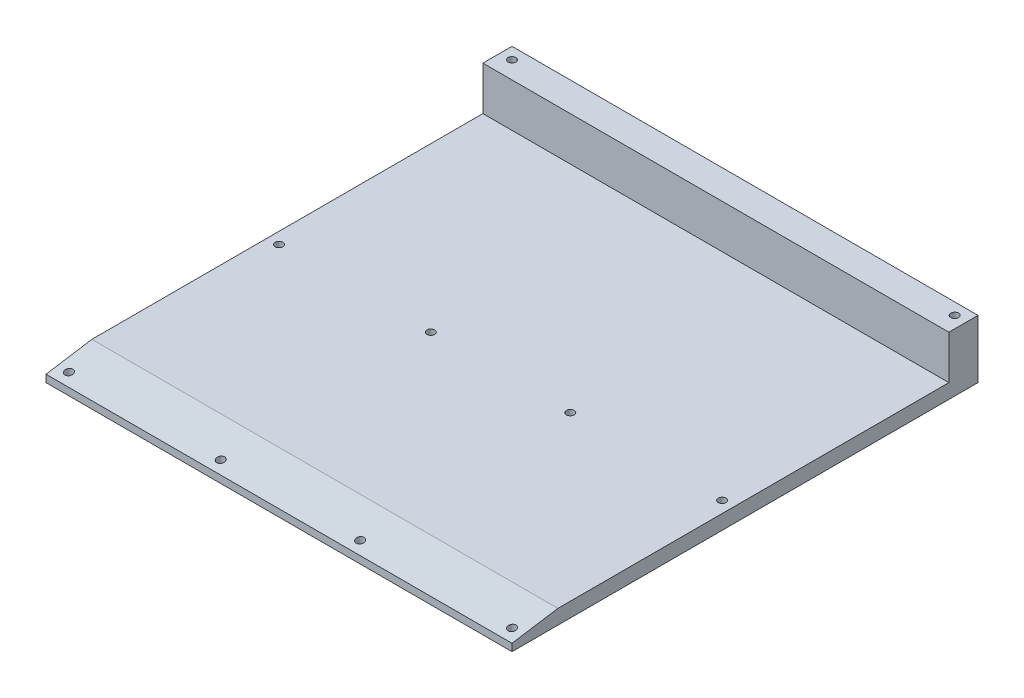
ISO-10303-21;
HEADER;
FILE_DESCRIPTION(('STEP AP214'),'2;1');
FILE_NAME('part.step','',(''),(''),'','','');
FILE_SCHEMA(('AUTOMOTIVE_DESIGN { 1 0 10303 214 1 1 1 1 }'));
ENDSEC;
DATA;
#1=APPLICATION_CONTEXT('core data for automotive mechanical design processes');
#2=APPLICATION_PROTOCOL_DEFINITION('international standard','automotive_design',2000,#1);
#3=PRODUCT_CONTEXT('',#1,'mechanical');
#4=PRODUCT('Part','Part','',(#3));
#5=PRODUCT_RELATED_PRODUCT_CATEGORY('part','',(#4));
#6=PRODUCT_DEFINITION_FORMATION('','',#4);
#7=PRODUCT_DEFINITION_CONTEXT('part definition',#1,'design');
#8=PRODUCT_DEFINITION('design','',#6,#7);
#9=PRODUCT_DEFINITION_SHAPE('','',#8);
#10=(LENGTH_UNIT() NAMED_UNIT(*) SI_UNIT(.MILLI.,.METRE.));
#11=(NAMED_UNIT(*) PLANE_ANGLE_UNIT() SI_UNIT($,.RADIAN.));
#12=(NAMED_UNIT(*) SI_UNIT($,.STERADIAN.) SOLID_ANGLE_UNIT());
#13=UNCERTAINTY_MEASURE_WITH_UNIT(LENGTH_MEASURE(1.E-05),#10,'distance_accuracy_value','');
#14=(GEOMETRIC_REPRESENTATION_CONTEXT(3) GLOBAL_UNCERTAINTY_ASSIGNED_CONTEXT((#13)) GLOBAL_UNIT_ASSIGNED_CONTEXT((#10,
#11,#12)) REPRESENTATION_CONTEXT('',''));
#15=CARTESIAN_POINT('',(0.,0.,0.));
#16=DIRECTION('',(0.,0.,1.));
#17=DIRECTION('',(1.,0.,0.));
#18=AXIS2_PLACEMENT_3D('',#15,#16,#17);
#19=CARTESIAN_POINT('',(0.,6.35,0.));
#20=DIRECTION('',(0.,1.,0.));
#21=DIRECTION('',(0.,0.,1.));
#22=AXIS2_PLACEMENT_3D('',#19,#20,#21);
#23=PLANE('',#22);
#24=DIRECTION('',(1.,0.,0.));
#25=VECTOR('',#24,1.);
#26=CARTESIAN_POINT('',(-127.,6.35,-190.5));
#27=LINE('',#26,#25);
#28=CARTESIAN_POINT('',(-127.,6.35,-190.5));
#29=VERTEX_POINT('',#28);
#30=CARTESIAN_POINT('',(76.2,6.35,-190.5));
#31=VERTEX_POINT('',#30);
#32=EDGE_CURVE('E62',#29,#31,#27,.T.);
#33=ORIENTED_EDGE('',*,*,#32,.F.);
#34=DIRECTION('',(0.,0.,-1.));
#35=VECTOR('',#34,1.);
#36=CARTESIAN_POINT('',(-127.,6.35,0.));
#37=LINE('',#36,#35);
#38=CARTESIAN_POINT('',(-127.,6.35,-20.));
#39=VERTEX_POINT('',#38);
#40=EDGE_CURVE('E132',#39,#29,#37,.T.);
#41=ORIENTED_EDGE('',*,*,#40,.F.);
#42=DIRECTION('',(-1.,0.,0.));
#43=VECTOR('',#42,1.);
#44=CARTESIAN_POINT('',(76.2,6.35,-20.));
#45=LINE('',#44,#43);
#46=CARTESIAN_POINT('',(76.2,6.35,-20.));
#47=VERTEX_POINT('',#46);
#48=EDGE_CURVE('E196',#47,#39,#45,.T.);
#49=ORIENTED_EDGE('',*,*,#48,.F.);
#50=DIRECTION('',(0.,0.,-1.));
#51=VECTOR('',#50,1.);
#52=CARTESIAN_POINT('',(76.2,6.35,0.));
#53=LINE('',#52,#51);
#54=EDGE_CURVE('E235',#47,#31,#53,.T.);
#55=ORIENTED_EDGE('',*,*,#54,.T.);
#56=EDGE_LOOP('',(#33,#41,#49,#55));
#57=FACE_BOUND('',#56,.T.);
#58=CARTESIAN_POINT('',(5.,6.35,-96.6));
#59=DIRECTION('',(0.,1.,0.));
#60=DIRECTION('',(0.,0.,1.));
#61=AXIS2_PLACEMENT_3D('',#58,#59,#60);
#62=CIRCLE('',#61,1.70000000000001);
#63=CARTESIAN_POINT('',(5.,6.35,-94.9));
#64=VERTEX_POINT('',#63);
#65=EDGE_CURVE('E219',#64,#64,#62,.T.);
#66=ORIENTED_EDGE('',*,*,#65,.F.);
#67=EDGE_LOOP('',(#66));
#68=FACE_BOUND('',#67,.T.);
#69=CARTESIAN_POINT('',(71.2,6.35,-96.6));
#70=DIRECTION('',(0.,1.,0.));
#71=DIRECTION('',(0.,0.,1.));
#72=AXIS2_PLACEMENT_3D('',#69,#70,#71);
#73=CIRCLE('',#72,1.7);
#74=CARTESIAN_POINT('',(71.2,6.35,-94.9));
#75=VERTEX_POINT('',#74);
#76=EDGE_CURVE('E220',#75,#75,#73,.F.);
#77=ORIENTED_EDGE('',*,*,#76,.T.);
#78=EDGE_LOOP('',(#77));
#79=FACE_BOUND('',#78,.T.);
#80=CARTESIAN_POINT('',(-55.8,6.35,-96.6));
#81=DIRECTION('',(0.,-1.,0.));
#82=DIRECTION('',(0.,0.,1.));
#83=AXIS2_PLACEMENT_3D('',#80,#81,#82);
#84=CIRCLE('',#83,1.70000000000001);
#85=CARTESIAN_POINT('',(-55.8,6.35,-94.9));
#86=VERTEX_POINT('',#85);
#87=EDGE_CURVE('E161',#86,#86,#84,.T.);
#88=ORIENTED_EDGE('',*,*,#87,.T.);
#89=EDGE_LOOP('',(#88));
#90=FACE_BOUND('',#89,.T.);
#91=CARTESIAN_POINT('',(-122.,6.35,-96.6));
#92=DIRECTION('',(0.,-1.,0.));
#93=DIRECTION('',(0.,0.,1.));
#94=AXIS2_PLACEMENT_3D('',#91,#92,#93);
#95=CIRCLE('',#94,1.7);
#96=CARTESIAN_POINT('',(-122.,6.35,-94.9));
#97=VERTEX_POINT('',#96);
#98=EDGE_CURVE('E162',#97,#97,#95,.F.);
#99=ORIENTED_EDGE('',*,*,#98,.F.);
#100=EDGE_LOOP('',(#99));
#101=FACE_BOUND('',#100,.T.);
#102=ADVANCED_FACE('F45',(#57,#68,#79,#90,#101),#23,.T.);
#103=CARTESIAN_POINT('',(0.,0.,0.));
#104=DIRECTION('',(0.,1.,0.));
#105=DIRECTION('',(0.,0.,1.));
#106=AXIS2_PLACEMENT_3D('',#103,#104,#105);
#107=PLANE('',#106);
#108=CARTESIAN_POINT('',(71.2,0.,-5.));
#109=DIRECTION('',(0.,1.,0.));
#110=DIRECTION('',(0.,0.,1.));
#111=AXIS2_PLACEMENT_3D('',#108,#109,#110);
#112=CIRCLE('',#111,1.7);
#113=CARTESIAN_POINT('',(71.2,0.,-3.30000000000001));
#114=VERTEX_POINT('',#113);
#115=EDGE_CURVE('E207',#114,#114,#112,.T.);
#116=ORIENTED_EDGE('',*,*,#115,.T.);
#117=EDGE_LOOP('',(#116));
#118=FACE_BOUND('',#117,.T.);
#119=CARTESIAN_POINT('',(71.12,0.,-198.12));
#120=DIRECTION('',(0.,1.,0.));
#121=DIRECTION('',(0.,0.,1.));
#122=AXIS2_PLACEMENT_3D('',#119,#120,#121);
#123=CIRCLE('',#122,1.7);
#124=CARTESIAN_POINT('',(71.12,0.,-196.42));
#125=VERTEX_POINT('',#124);
#126=EDGE_CURVE('E206',#125,#125,#123,.T.);
#127=ORIENTED_EDGE('',*,*,#126,.T.);
#128=EDGE_LOOP('',(#127));
#129=FACE_BOUND('',#128,.T.);
#130=CARTESIAN_POINT('',(5.,0.,-96.6));
#131=DIRECTION('',(0.,1.,0.));
#132=DIRECTION('',(0.,0.,1.));
#133=AXIS2_PLACEMENT_3D('',#130,#131,#132);
#134=CIRCLE('',#133,1.70000000000001);
#135=CARTESIAN_POINT('',(5.,0.,-94.9));
#136=VERTEX_POINT('',#135);
#137=EDGE_CURVE('E227',#136,#136,#134,.T.);
#138=ORIENTED_EDGE('',*,*,#137,.T.);
#139=EDGE_LOOP('',(#138));
#140=FACE_BOUND('',#139,.T.);
#141=DIRECTION('',(1.,0.,0.));
#142=VECTOR('',#141,1.);
#143=CARTESIAN_POINT('',(0.,0.,0.));
#144=LINE('',#143,#142);
#145=CARTESIAN_POINT('',(-127.,0.,0.));
#146=VERTEX_POINT('',#145);
#147=CARTESIAN_POINT('',(76.2,0.,0.));
#148=VERTEX_POINT('',#147);
#149=EDGE_CURVE('E231',#146,#148,#144,.T.);
#150=ORIENTED_EDGE('',*,*,#149,.F.);
#151=DIRECTION('',(0.,0.,-1.));
#152=VECTOR('',#151,1.);
#153=CARTESIAN_POINT('',(-127.,0.,0.));
#154=LINE('',#153,#152);
#155=CARTESIAN_POINT('',(-127.,0.,-203.2));
#156=VERTEX_POINT('',#155);
#157=EDGE_CURVE('E173',#146,#156,#154,.T.);
#158=ORIENTED_EDGE('',*,*,#157,.T.);
#159=DIRECTION('',(-1.,0.,0.));
#160=VECTOR('',#159,1.);
#161=CARTESIAN_POINT('',(0.,0.,-203.2));
#162=LINE('',#161,#160);
#163=CARTESIAN_POINT('',(76.2,0.,-203.2));
#164=VERTEX_POINT('',#163);
#165=EDGE_CURVE('E238',#164,#156,#162,.T.);
#166=ORIENTED_EDGE('',*,*,#165,.F.);
#167=DIRECTION('',(0.,0.,-1.));
#168=VECTOR('',#167,1.);
#169=CARTESIAN_POINT('',(76.2,0.,0.));
#170=LINE('',#169,#168);
#171=EDGE_CURVE('E69',#148,#164,#170,.T.);
#172=ORIENTED_EDGE('',*,*,#171,.F.);
#173=EDGE_LOOP('',(#150,#158,#166,#172));
#174=FACE_BOUND('',#173,.T.);
#175=CARTESIAN_POINT('',(5.,0.,-5.));
#176=DIRECTION('',(0.,1.,0.));
#177=DIRECTION('',(0.,0.,1.));
#178=AXIS2_PLACEMENT_3D('',#175,#176,#177);
#179=CIRCLE('',#178,1.7);
#180=CARTESIAN_POINT('',(5.,0.,-3.30000000000001));
#181=VERTEX_POINT('',#180);
#182=EDGE_CURVE('E211',#181,#181,#179,.F.);
#183=ORIENTED_EDGE('',*,*,#182,.F.);
#184=EDGE_LOOP('',(#183));
#185=FACE_BOUND('',#184,.T.);
#186=CARTESIAN_POINT('',(71.2,0.,-96.6));
#187=DIRECTION('',(0.,1.,0.));
#188=DIRECTION('',(0.,0.,1.));
#189=AXIS2_PLACEMENT_3D('',#186,#187,#188);
#190=CIRCLE('',#189,1.7);
#191=CARTESIAN_POINT('',(71.2,0.,-94.9));
#192=VERTEX_POINT('',#191);
#193=EDGE_CURVE('E215',#192,#192,#190,.F.);
#194=ORIENTED_EDGE('',*,*,#193,.F.);
#195=EDGE_LOOP('',(#194));
#196=FACE_BOUND('',#195,.T.);
#197=CARTESIAN_POINT('',(-122.,0.,-5.));
#198=DIRECTION('',(0.,-1.,0.));
#199=DIRECTION('',(0.,0.,1.));
#200=AXIS2_PLACEMENT_3D('',#197,#198,#199);
#201=CIRCLE('',#200,1.7);
#202=CARTESIAN_POINT('',(-122.,0.,-3.30000000000001));
#203=VERTEX_POINT('',#202);
#204=EDGE_CURVE('E149',#203,#203,#201,.T.);
#205=ORIENTED_EDGE('',*,*,#204,.F.);
#206=EDGE_LOOP('',(#205));
#207=FACE_BOUND('',#206,.T.);
#208=CARTESIAN_POINT('',(-121.92,0.,-198.12));
#209=DIRECTION('',(0.,-1.,0.));
#210=DIRECTION('',(0.,0.,1.));
#211=AXIS2_PLACEMENT_3D('',#208,#209,#210);
#212=CIRCLE('',#211,1.7);
#213=CARTESIAN_POINT('',(-121.92,0.,-196.42));
#214=VERTEX_POINT('',#213);
#215=EDGE_CURVE('E148',#214,#214,#212,.T.);
#216=ORIENTED_EDGE('',*,*,#215,.F.);
#217=EDGE_LOOP('',(#216));
#218=FACE_BOUND('',#217,.T.);
#219=CARTESIAN_POINT('',(-55.8,0.,-96.6));
#220=DIRECTION('',(0.,-1.,0.));
#221=DIRECTION('',(0.,0.,1.));
#222=AXIS2_PLACEMENT_3D('',#219,#220,#221);
#223=CIRCLE('',#222,1.70000000000001);
#224=CARTESIAN_POINT('',(-55.8,0.,-94.9));
#225=VERTEX_POINT('',#224);
#226=EDGE_CURVE('E169',#225,#225,#223,.T.);
#227=ORIENTED_EDGE('',*,*,#226,.F.);
#228=EDGE_LOOP('',(#227));
#229=FACE_BOUND('',#228,.T.);
#230=CARTESIAN_POINT('',(-55.8,0.,-5.));
#231=DIRECTION('',(0.,-1.,0.));
#232=DIRECTION('',(0.,0.,1.));
#233=AXIS2_PLACEMENT_3D('',#230,#231,#232);
#234=CIRCLE('',#233,1.7);
#235=CARTESIAN_POINT('',(-55.8,0.,-3.30000000000001));
#236=VERTEX_POINT('',#235);
#237=EDGE_CURVE('E153',#236,#236,#234,.F.);
#238=ORIENTED_EDGE('',*,*,#237,.T.);
#239=EDGE_LOOP('',(#238));
#240=FACE_BOUND('',#239,.T.);
#241=CARTESIAN_POINT('',(-122.,0.,-96.6));
#242=DIRECTION('',(0.,-1.,0.));
#243=DIRECTION('',(0.,0.,1.));
#244=AXIS2_PLACEMENT_3D('',#241,#242,#243);
#245=CIRCLE('',#244,1.7);
#246=CARTESIAN_POINT('',(-122.,0.,-94.9));
#247=VERTEX_POINT('',#246);
#248=EDGE_CURVE('E157',#247,#247,#245,.F.);
#249=ORIENTED_EDGE('',*,*,#248,.T.);
#250=EDGE_LOOP('',(#249));
#251=FACE_BOUND('',#250,.T.);
#252=ADVANCED_FACE('F251',(#118,#129,#140,#174,#185,#196,#207,#218,#229,#240,#251),#107,.F.);
#253=CARTESIAN_POINT('',(0.,6.35,0.));
#254=DIRECTION('',(0.,0.,-1.));
#255=DIRECTION('',(-1.,0.,0.));
#256=AXIS2_PLACEMENT_3D('',#253,#254,#255);
#257=PLANE('',#256);
#258=DIRECTION('',(0.,-1.,0.));
#259=VECTOR('',#258,1.);
#260=CARTESIAN_POINT('',(76.2,6.35,0.));
#261=LINE('',#260,#259);
#262=CARTESIAN_POINT('',(76.2,3.175,0.));
#263=VERTEX_POINT('',#262);
#264=EDGE_CURVE('E11',#263,#148,#261,.T.);
#265=ORIENTED_EDGE('',*,*,#264,.F.);
#266=DIRECTION('',(-1.,0.,0.));
#267=VECTOR('',#266,1.);
#268=CARTESIAN_POINT('',(76.2,3.175,0.));
#269=LINE('',#268,#267);
#270=CARTESIAN_POINT('',(-127.,3.175,0.));
#271=VERTEX_POINT('',#270);
#272=EDGE_CURVE('E197',#263,#271,#269,.T.);
#273=ORIENTED_EDGE('',*,*,#272,.T.);
#274=DIRECTION('',(0.,-1.,0.));
#275=VECTOR('',#274,1.);
#276=CARTESIAN_POINT('',(-127.,6.35,0.));
#277=LINE('',#276,#275);
#278=EDGE_CURVE('E185',#271,#146,#277,.T.);
#279=ORIENTED_EDGE('',*,*,#278,.T.);
#280=ORIENTED_EDGE('',*,*,#149,.T.);
#281=EDGE_LOOP('',(#265,#273,#279,#280));
#282=FACE_BOUND('',#281,.T.);
#283=ADVANCED_FACE('F47',(#282),#257,.F.);
#284=CARTESIAN_POINT('',(76.2,6.35,0.));
#285=DIRECTION('',(-1.,0.,0.));
#286=DIRECTION('',(0.,0.,1.));
#287=AXIS2_PLACEMENT_3D('',#284,#285,#286);
#288=PLANE('',#287);
#289=ORIENTED_EDGE('',*,*,#54,.F.);
#290=DIRECTION('',(0.,-0.156786658464522,0.987632494264709));
#291=VECTOR('',#290,1.);
#292=CARTESIAN_POINT('',(76.2,3.0969519713349,0.491641125449416));
#293=LINE('',#292,#291);
#294=EDGE_CURVE('E189',#47,#263,#293,.T.);
#295=ORIENTED_EDGE('',*,*,#294,.T.);
#296=ORIENTED_EDGE('',*,*,#264,.T.);
#297=ORIENTED_EDGE('',*,*,#171,.T.);
#298=DIRECTION('',(0.,-1.,0.));
#299=VECTOR('',#298,1.);
#300=CARTESIAN_POINT('',(76.2,6.35,-203.2));
#301=LINE('',#300,#299);
#302=CARTESIAN_POINT('',(76.2,25.4,-203.2));
#303=VERTEX_POINT('',#302);
#304=EDGE_CURVE('E55',#303,#164,#301,.T.);
#305=ORIENTED_EDGE('',*,*,#304,.F.);
#306=DIRECTION('',(0.,0.,-1.));
#307=VECTOR('',#306,1.);
#308=CARTESIAN_POINT('',(76.2,25.4,-203.2));
#309=LINE('',#308,#307);
#310=CARTESIAN_POINT('',(76.2,25.4,-190.5));
#311=VERTEX_POINT('',#310);
#312=EDGE_CURVE('E117',#311,#303,#309,.T.);
#313=ORIENTED_EDGE('',*,*,#312,.F.);
#314=DIRECTION('',(0.,-1.,0.));
#315=VECTOR('',#314,1.);
#316=CARTESIAN_POINT('',(76.2,25.4,-190.5));
#317=LINE('',#316,#315);
#318=EDGE_CURVE('E112',#311,#31,#317,.T.);
#319=ORIENTED_EDGE('',*,*,#318,.T.);
#320=EDGE_LOOP('',(#289,#295,#296,#297,#305,#313,#319));
#321=FACE_BOUND('',#320,.T.);
#322=ADVANCED_FACE('F263',(#321),#288,.F.);
#323=CARTESIAN_POINT('',(0.,6.35,-203.2));
#324=DIRECTION('',(0.,0.,1.));
#325=DIRECTION('',(1.,0.,0.));
#326=AXIS2_PLACEMENT_3D('',#323,#324,#325);
#327=PLANE('',#326);
#328=ORIENTED_EDGE('',*,*,#165,.T.);
#329=DIRECTION('',(0.,-1.,0.));
#330=VECTOR('',#329,1.);
#331=CARTESIAN_POINT('',(-127.,6.35,-203.2));
#332=LINE('',#331,#330);
#333=CARTESIAN_POINT('',(-127.,25.4,-203.2));
#334=VERTEX_POINT('',#333);
#335=EDGE_CURVE('E179',#334,#156,#332,.T.);
#336=ORIENTED_EDGE('',*,*,#335,.F.);
#337=DIRECTION('',(-1.,0.,0.));
#338=VECTOR('',#337,1.);
#339=CARTESIAN_POINT('',(-127.,25.4,-203.2));
#340=LINE('',#339,#338);
#341=EDGE_CURVE('E125',#303,#334,#340,.T.);
#342=ORIENTED_EDGE('',*,*,#341,.F.);
#343=ORIENTED_EDGE('',*,*,#304,.T.);
#344=EDGE_LOOP('',(#328,#336,#342,#343));
#345=FACE_BOUND('',#344,.T.);
#346=ADVANCED_FACE('F249',(#345),#327,.F.);
#347=CARTESIAN_POINT('',(5.,0.,-96.6));
#348=DIRECTION('',(0.,1.,0.));
#349=DIRECTION('',(0.,0.,1.));
#350=AXIS2_PLACEMENT_3D('',#347,#348,#349);
#351=CYLINDRICAL_SURFACE('',#350,1.70000000000001);
#352=ORIENTED_EDGE('',*,*,#137,.F.);
#353=EDGE_LOOP('',(#352));
#354=FACE_BOUND('',#353,.T.);
#355=ORIENTED_EDGE('',*,*,#65,.T.);
#356=EDGE_LOOP('',(#355));
#357=FACE_BOUND('',#356,.T.);
#358=ADVANCED_FACE('F304',(#354,#357),#351,.F.);
#359=CARTESIAN_POINT('',(71.12,0.,-198.12));
#360=DIRECTION('',(0.,1.,0.));
#361=DIRECTION('',(0.,0.,1.));
#362=AXIS2_PLACEMENT_3D('',#359,#360,#361);
#363=CYLINDRICAL_SURFACE('',#362,1.7);
#364=ORIENTED_EDGE('',*,*,#126,.F.);
#365=EDGE_LOOP('',(#364));
#366=FACE_BOUND('',#365,.T.);
#367=CARTESIAN_POINT('',(71.12,25.4,-198.12));
#368=DIRECTION('',(0.,1.,0.));
#369=DIRECTION('',(0.,0.,-1.));
#370=AXIS2_PLACEMENT_3D('',#367,#368,#369);
#371=CIRCLE('',#370,1.70000000000001);
#372=CARTESIAN_POINT('',(71.12,25.4,-199.82));
#373=VERTEX_POINT('',#372);
#374=EDGE_CURVE('E272',#373,#373,#371,.T.);
#375=ORIENTED_EDGE('',*,*,#374,.T.);
#376=EDGE_LOOP('',(#375));
#377=FACE_BOUND('',#376,.T.);
#378=ADVANCED_FACE('F281',(#366,#377),#363,.F.);
#379=CARTESIAN_POINT('',(71.2,0.,-5.));
#380=DIRECTION('',(0.,1.,0.));
#381=DIRECTION('',(0.,0.,1.));
#382=AXIS2_PLACEMENT_3D('',#379,#380,#381);
#383=CYLINDRICAL_SURFACE('',#382,1.7);
#384=CARTESIAN_POINT('',(71.2,3.96875,-5.));
#385=DIRECTION('',(0.,-0.987632494264708,-0.156786658464522));
#386=DIRECTION('',(0.,0.156786658464522,-0.987632494264709));
#387=AXIS2_PLACEMENT_3D('',#384,#385,#386);
#388=ELLIPSE('',#387,1.72128803970312,1.7);
#389=CARTESIAN_POINT('',(71.2,4.238625,-6.7));
#390=VERTEX_POINT('',#389);
#391=EDGE_CURVE('E202',#390,#390,#388,.F.);
#392=ORIENTED_EDGE('',*,*,#391,.T.);
#393=EDGE_LOOP('',(#392));
#394=FACE_BOUND('',#393,.T.);
#395=ORIENTED_EDGE('',*,*,#115,.F.);
#396=EDGE_LOOP('',(#395));
#397=FACE_BOUND('',#396,.T.);
#398=ADVANCED_FACE('F393',(#394,#397),#383,.F.);
#399=CARTESIAN_POINT('',(5.,0.,-5.));
#400=DIRECTION('',(0.,1.,0.));
#401=DIRECTION('',(0.,0.,1.));
#402=AXIS2_PLACEMENT_3D('',#399,#400,#401);
#403=CYLINDRICAL_SURFACE('',#402,1.7);
#404=CARTESIAN_POINT('',(5.,3.96875,-5.));
#405=DIRECTION('',(0.,-0.987632494264708,-0.156786658464522));
#406=DIRECTION('',(0.,0.156786658464522,-0.987632494264709));
#407=AXIS2_PLACEMENT_3D('',#404,#405,#406);
#408=ELLIPSE('',#407,1.72128803970312,1.7);
#409=CARTESIAN_POINT('',(5.,4.238625,-6.7));
#410=VERTEX_POINT('',#409);
#411=EDGE_CURVE('E49',#410,#410,#408,.T.);
#412=ORIENTED_EDGE('',*,*,#411,.F.);
#413=EDGE_LOOP('',(#412));
#414=FACE_BOUND('',#413,.T.);
#415=ORIENTED_EDGE('',*,*,#182,.T.);
#416=EDGE_LOOP('',(#415));
#417=FACE_BOUND('',#416,.T.);
#418=ADVANCED_FACE('F460',(#414,#417),#403,.F.);
#419=CARTESIAN_POINT('',(71.2,0.,-96.6));
#420=DIRECTION('',(0.,1.,0.));
#421=DIRECTION('',(0.,0.,1.));
#422=AXIS2_PLACEMENT_3D('',#419,#420,#421);
#423=CYLINDRICAL_SURFACE('',#422,1.7);
#424=ORIENTED_EDGE('',*,*,#193,.T.);
#425=EDGE_LOOP('',(#424));
#426=FACE_BOUND('',#425,.T.);
#427=ORIENTED_EDGE('',*,*,#76,.F.);
#428=EDGE_LOOP('',(#427));
#429=FACE_BOUND('',#428,.T.);
#430=ADVANCED_FACE('F324',(#426,#429),#423,.F.);
#431=CARTESIAN_POINT('',(76.2,3.0969519713349,0.491641125449416));
#432=DIRECTION('',(0.,-0.987632494264708,-0.156786658464522));
#433=DIRECTION('',(0.,0.156786658464522,-0.987632494264709));
#434=AXIS2_PLACEMENT_3D('',#431,#432,#433);
#435=PLANE('',#434);
#436=ORIENTED_EDGE('',*,*,#48,.T.);
#437=DIRECTION('',(0.,-0.156786658464522,0.987632494264709));
#438=VECTOR('',#437,1.);
#439=CARTESIAN_POINT('',(-127.,3.0969519713349,0.491641125449416));
#440=LINE('',#439,#438);
#441=EDGE_CURVE('E134',#39,#271,#440,.T.);
#442=ORIENTED_EDGE('',*,*,#441,.T.);
#443=ORIENTED_EDGE('',*,*,#272,.F.);
#444=ORIENTED_EDGE('',*,*,#294,.F.);
#445=EDGE_LOOP('',(#436,#442,#443,#444));
#446=FACE_BOUND('',#445,.T.);
#447=ORIENTED_EDGE('',*,*,#411,.T.);
#448=EDGE_LOOP('',(#447));
#449=FACE_BOUND('',#448,.T.);
#450=ORIENTED_EDGE('',*,*,#391,.F.);
#451=EDGE_LOOP('',(#450));
#452=FACE_BOUND('',#451,.T.);
#453=CARTESIAN_POINT('',(-55.8,3.96875,-5.));
#454=DIRECTION('',(0.,0.987632494264708,0.156786658464522));
#455=DIRECTION('',(0.,0.156786658464522,-0.987632494264709));
#456=AXIS2_PLACEMENT_3D('',#453,#454,#455);
#457=ELLIPSE('',#456,1.72128803970312,1.7);
#458=CARTESIAN_POINT('',(-55.8,4.238625,-6.7));
#459=VERTEX_POINT('',#458);
#460=EDGE_CURVE('E139',#459,#459,#457,.T.);
#461=ORIENTED_EDGE('',*,*,#460,.F.);
#462=EDGE_LOOP('',(#461));
#463=FACE_BOUND('',#462,.T.);
#464=CARTESIAN_POINT('',(-122.,3.96875,-5.));
#465=DIRECTION('',(0.,0.987632494264708,0.156786658464522));
#466=DIRECTION('',(0.,0.156786658464522,-0.987632494264709));
#467=AXIS2_PLACEMENT_3D('',#464,#465,#466);
#468=ELLIPSE('',#467,1.72128803970312,1.7);
#469=CARTESIAN_POINT('',(-122.,4.238625,-6.7));
#470=VERTEX_POINT('',#469);
#471=EDGE_CURVE('E144',#470,#470,#468,.F.);
#472=ORIENTED_EDGE('',*,*,#471,.T.);
#473=EDGE_LOOP('',(#472));
#474=FACE_BOUND('',#473,.T.);
#475=ADVANCED_FACE('F258',(#446,#449,#452,#463,#474),#435,.F.);
#476=CARTESIAN_POINT('',(-127.,6.35,0.));
#477=DIRECTION('',(1.,0.,0.));
#478=DIRECTION('',(0.,0.,1.));
#479=AXIS2_PLACEMENT_3D('',#476,#477,#478);
#480=PLANE('',#479);
#481=ORIENTED_EDGE('',*,*,#40,.T.);
#482=DIRECTION('',(0.,-1.,0.));
#483=VECTOR('',#482,1.);
#484=CARTESIAN_POINT('',(-127.,25.4,-190.5));
#485=LINE('',#484,#483);
#486=CARTESIAN_POINT('',(-127.,25.4,-190.5));
#487=VERTEX_POINT('',#486);
#488=EDGE_CURVE('E110',#487,#29,#485,.T.);
#489=ORIENTED_EDGE('',*,*,#488,.F.);
#490=DIRECTION('',(0.,0.,1.));
#491=VECTOR('',#490,1.);
#492=CARTESIAN_POINT('',(-127.,25.4,-203.2));
#493=LINE('',#492,#491);
#494=EDGE_CURVE('E118',#334,#487,#493,.T.);
#495=ORIENTED_EDGE('',*,*,#494,.F.);
#496=ORIENTED_EDGE('',*,*,#335,.T.);
#497=ORIENTED_EDGE('',*,*,#157,.F.);
#498=ORIENTED_EDGE('',*,*,#278,.F.);
#499=ORIENTED_EDGE('',*,*,#441,.F.);
#500=EDGE_LOOP('',(#481,#489,#495,#496,#497,#498,#499));
#501=FACE_BOUND('',#500,.T.);
#502=ADVANCED_FACE('F130',(#501),#480,.F.);
#503=CARTESIAN_POINT('',(-55.8,0.,-96.6));
#504=DIRECTION('',(0.,1.,0.));
#505=DIRECTION('',(0.,0.,1.));
#506=AXIS2_PLACEMENT_3D('',#503,#504,#505);
#507=CYLINDRICAL_SURFACE('',#506,1.70000000000001);
#508=ORIENTED_EDGE('',*,*,#226,.T.);
#509=EDGE_LOOP('',(#508));
#510=FACE_BOUND('',#509,.T.);
#511=ORIENTED_EDGE('',*,*,#87,.F.);
#512=EDGE_LOOP('',(#511));
#513=FACE_BOUND('',#512,.T.);
#514=ADVANCED_FACE('F329',(#510,#513),#507,.F.);
#515=CARTESIAN_POINT('',(-121.92,0.,-198.12));
#516=DIRECTION('',(0.,1.,0.));
#517=DIRECTION('',(0.,0.,1.));
#518=AXIS2_PLACEMENT_3D('',#515,#516,#517);
#519=CYLINDRICAL_SURFACE('',#518,1.7);
#520=ORIENTED_EDGE('',*,*,#215,.T.);
#521=EDGE_LOOP('',(#520));
#522=FACE_BOUND('',#521,.T.);
#523=CARTESIAN_POINT('',(-121.92,25.4,-198.12));
#524=DIRECTION('',(0.,1.,0.));
#525=DIRECTION('',(0.,0.,1.));
#526=AXIS2_PLACEMENT_3D('',#523,#524,#525);
#527=CIRCLE('',#526,1.70000000000001);
#528=CARTESIAN_POINT('',(-121.92,25.4,-196.42));
#529=VERTEX_POINT('',#528);
#530=EDGE_CURVE('E269',#529,#529,#527,.T.);
#531=ORIENTED_EDGE('',*,*,#530,.T.);
#532=EDGE_LOOP('',(#531));
#533=FACE_BOUND('',#532,.T.);
#534=ADVANCED_FACE('F333',(#522,#533),#519,.F.);
#535=CARTESIAN_POINT('',(-122.,0.,-5.));
#536=DIRECTION('',(0.,1.,0.));
#537=DIRECTION('',(0.,0.,1.));
#538=AXIS2_PLACEMENT_3D('',#535,#536,#537);
#539=CYLINDRICAL_SURFACE('',#538,1.7);
#540=ORIENTED_EDGE('',*,*,#471,.F.);
#541=EDGE_LOOP('',(#540));
#542=FACE_BOUND('',#541,.T.);
#543=ORIENTED_EDGE('',*,*,#204,.T.);
#544=EDGE_LOOP('',(#543));
#545=FACE_BOUND('',#544,.T.);
#546=ADVANCED_FACE('F340',(#542,#545),#539,.F.);
#547=CARTESIAN_POINT('',(-55.8,0.,-5.));
#548=DIRECTION('',(0.,1.,0.));
#549=DIRECTION('',(0.,0.,1.));
#550=AXIS2_PLACEMENT_3D('',#547,#548,#549);
#551=CYLINDRICAL_SURFACE('',#550,1.7);
#552=ORIENTED_EDGE('',*,*,#460,.T.);
#553=EDGE_LOOP('',(#552));
#554=FACE_BOUND('',#553,.T.);
#555=ORIENTED_EDGE('',*,*,#237,.F.);
#556=EDGE_LOOP('',(#555));
#557=FACE_BOUND('',#556,.T.);
#558=ADVANCED_FACE('F292',(#554,#557),#551,.F.);
#559=CARTESIAN_POINT('',(-122.,0.,-96.6));
#560=DIRECTION('',(0.,1.,0.));
#561=DIRECTION('',(0.,0.,1.));
#562=AXIS2_PLACEMENT_3D('',#559,#560,#561);
#563=CYLINDRICAL_SURFACE('',#562,1.7);
#564=ORIENTED_EDGE('',*,*,#248,.F.);
#565=EDGE_LOOP('',(#564));
#566=FACE_BOUND('',#565,.T.);
#567=ORIENTED_EDGE('',*,*,#98,.T.);
#568=EDGE_LOOP('',(#567));
#569=FACE_BOUND('',#568,.T.);
#570=ADVANCED_FACE('F283',(#566,#569),#563,.F.);
#571=CARTESIAN_POINT('',(0.,25.4,0.));
#572=DIRECTION('',(0.,1.,0.));
#573=DIRECTION('',(0.,0.,1.));
#574=AXIS2_PLACEMENT_3D('',#571,#572,#573);
#575=PLANE('',#574);
#576=ORIENTED_EDGE('',*,*,#530,.F.);
#577=EDGE_LOOP('',(#576));
#578=FACE_BOUND('',#577,.T.);
#579=ORIENTED_EDGE('',*,*,#494,.T.);
#580=DIRECTION('',(1.,0.,0.));
#581=VECTOR('',#580,1.);
#582=CARTESIAN_POINT('',(-127.,25.4,-190.5));
#583=LINE('',#582,#581);
#584=EDGE_CURVE('E106',#487,#311,#583,.T.);
#585=ORIENTED_EDGE('',*,*,#584,.T.);
#586=ORIENTED_EDGE('',*,*,#312,.T.);
#587=ORIENTED_EDGE('',*,*,#341,.T.);
#588=EDGE_LOOP('',(#579,#585,#586,#587));
#589=FACE_BOUND('',#588,.T.);
#590=ORIENTED_EDGE('',*,*,#374,.F.);
#591=EDGE_LOOP('',(#590));
#592=FACE_BOUND('',#591,.T.);
#593=ADVANCED_FACE('F122',(#578,#589,#592),#575,.T.);
#594=CARTESIAN_POINT('',(-127.,25.4,-190.5));
#595=DIRECTION('',(0.,0.,-1.));
#596=DIRECTION('',(-1.,0.,0.));
#597=AXIS2_PLACEMENT_3D('',#594,#595,#596);
#598=PLANE('',#597);
#599=ORIENTED_EDGE('',*,*,#32,.T.);
#600=ORIENTED_EDGE('',*,*,#318,.F.);
#601=ORIENTED_EDGE('',*,*,#584,.F.);
#602=ORIENTED_EDGE('',*,*,#488,.T.);
#603=EDGE_LOOP('',(#599,#600,#601,#602));
#604=FACE_BOUND('',#603,.T.);
#605=ADVANCED_FACE('F108',(#604),#598,.F.);
#606=CLOSED_SHELL('',(#102,#252,#283,#322,#346,#358,#378,#398,#418,#430,#475,#502,#514,#534,
#546,#558,#570,#593,#605));
#607=MANIFOLD_SOLID_BREP('B2',#606);
#608=ADVANCED_BREP_SHAPE_REPRESENTATION('',(#18,#607),#14);
#609=SHAPE_DEFINITION_REPRESENTATION(#9,#608);
ENDSEC;
END-ISO-10303-21;
